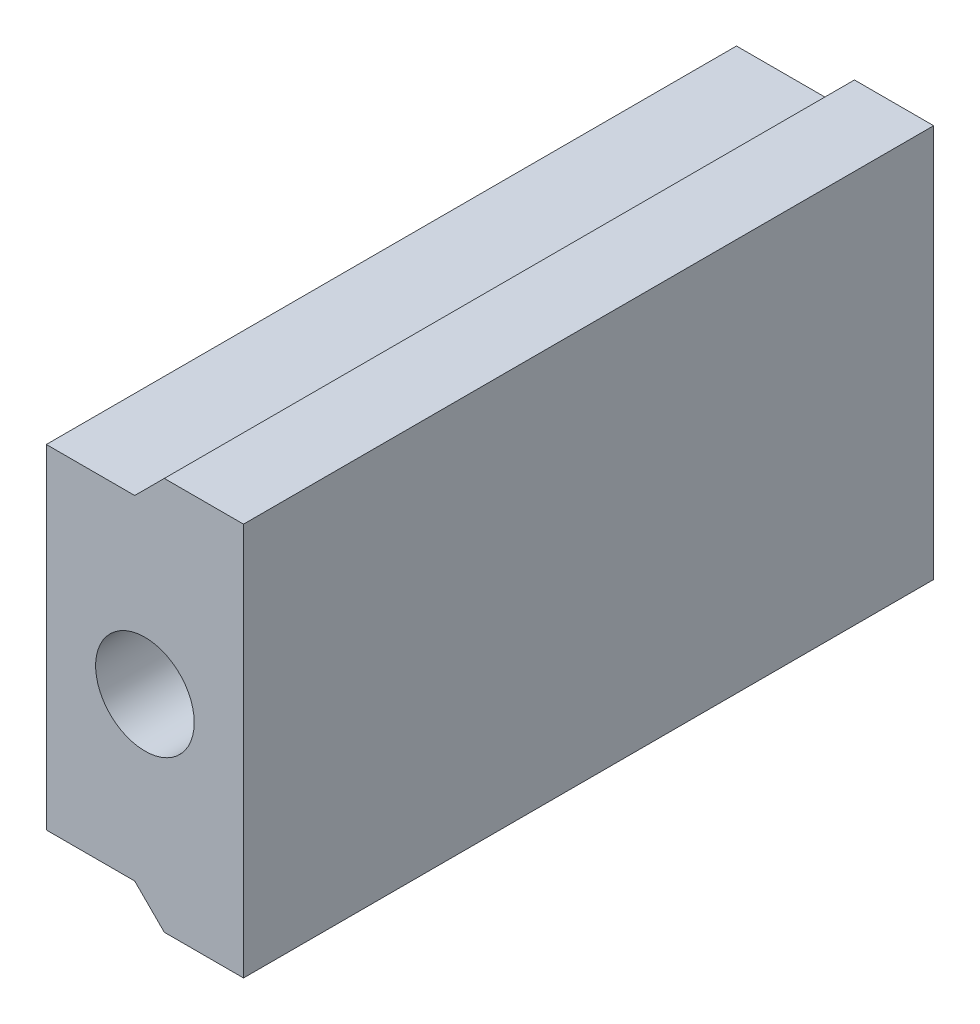
ISO-10303-21;
HEADER;
FILE_DESCRIPTION(('STEP AP214'),'2;1');
FILE_NAME('part.step','',(''),(''),'','','');
FILE_SCHEMA(('AUTOMOTIVE_DESIGN { 1 0 10303 214 1 1 1 1 }'));
ENDSEC;
DATA;
#1=APPLICATION_CONTEXT('core data for automotive mechanical design processes');
#2=APPLICATION_PROTOCOL_DEFINITION('international standard','automotive_design',2000,#1);
#3=PRODUCT_CONTEXT('',#1,'mechanical');
#4=PRODUCT('Part','Part','',(#3));
#5=PRODUCT_RELATED_PRODUCT_CATEGORY('part','',(#4));
#6=PRODUCT_DEFINITION_FORMATION('','',#4);
#7=PRODUCT_DEFINITION_CONTEXT('part definition',#1,'design');
#8=PRODUCT_DEFINITION('design','',#6,#7);
#9=PRODUCT_DEFINITION_SHAPE('','',#8);
#10=(LENGTH_UNIT() NAMED_UNIT(*) SI_UNIT(.MILLI.,.METRE.));
#11=(NAMED_UNIT(*) PLANE_ANGLE_UNIT() SI_UNIT($,.RADIAN.));
#12=(NAMED_UNIT(*) SI_UNIT($,.STERADIAN.) SOLID_ANGLE_UNIT());
#13=UNCERTAINTY_MEASURE_WITH_UNIT(LENGTH_MEASURE(1.E-05),#10,'distance_accuracy_value','');
#14=(GEOMETRIC_REPRESENTATION_CONTEXT(3) GLOBAL_UNCERTAINTY_ASSIGNED_CONTEXT((#13)) GLOBAL_UNIT_ASSIGNED_CONTEXT((#10,
#11,#12)) REPRESENTATION_CONTEXT('',''));
#15=CARTESIAN_POINT('',(0.,0.,0.));
#16=DIRECTION('',(0.,0.,1.));
#17=DIRECTION('',(1.,0.,0.));
#18=AXIS2_PLACEMENT_3D('',#15,#16,#17);
#19=CARTESIAN_POINT('',(-10.,19.932856676292,70.));
#20=DIRECTION('',(1.,0.,0.));
#21=DIRECTION('',(0.,0.,-1.));
#22=AXIS2_PLACEMENT_3D('',#19,#20,#21);
#23=PLANE('',#22);
#24=DIRECTION('',(0.,-1.,0.));
#25=VECTOR('',#24,1.);
#26=CARTESIAN_POINT('',(-10.,19.932856676292,0.));
#27=LINE('',#26,#25);
#28=CARTESIAN_POINT('',(-10.,16.932856676292,0.));
#29=VERTEX_POINT('',#28);
#30=CARTESIAN_POINT('',(-10.,-16.932856676292,0.));
#31=VERTEX_POINT('',#30);
#32=EDGE_CURVE('E132',#29,#31,#27,.T.);
#33=ORIENTED_EDGE('',*,*,#32,.T.);
#34=DIRECTION('',(0.,0.,1.));
#35=VECTOR('',#34,1.);
#36=CARTESIAN_POINT('',(-10.,-16.932856676292,0.));
#37=LINE('',#36,#35);
#38=CARTESIAN_POINT('',(-10.,-16.932856676292,70.));
#39=VERTEX_POINT('',#38);
#40=EDGE_CURVE('E61',#31,#39,#37,.T.);
#41=ORIENTED_EDGE('',*,*,#40,.T.);
#42=DIRECTION('',(0.,-1.,0.));
#43=VECTOR('',#42,1.);
#44=CARTESIAN_POINT('',(-10.,19.932856676292,70.));
#45=LINE('',#44,#43);
#46=CARTESIAN_POINT('',(-10.,16.932856676292,70.));
#47=VERTEX_POINT('',#46);
#48=EDGE_CURVE('E151',#47,#39,#45,.T.);
#49=ORIENTED_EDGE('',*,*,#48,.F.);
#50=DIRECTION('',(0.,0.,1.));
#51=VECTOR('',#50,1.);
#52=CARTESIAN_POINT('',(-10.,16.932856676292,0.));
#53=LINE('',#52,#51);
#54=EDGE_CURVE('E147',#29,#47,#53,.T.);
#55=ORIENTED_EDGE('',*,*,#54,.F.);
#56=EDGE_LOOP('',(#33,#41,#49,#55));
#57=FACE_BOUND('',#56,.T.);
#58=ADVANCED_FACE('F39',(#57),#23,.F.);
#59=CARTESIAN_POINT('',(-10.,19.932856676292,70.));
#60=DIRECTION('',(0.,-1.,0.));
#61=DIRECTION('',(0.,0.,-1.));
#62=AXIS2_PLACEMENT_3D('',#59,#60,#61);
#63=PLANE('',#62);
#64=DIRECTION('',(0.,0.,1.));
#65=VECTOR('',#64,1.);
#66=CARTESIAN_POINT('',(1.96472234354229,19.932856676292,0.));
#67=LINE('',#66,#65);
#68=CARTESIAN_POINT('',(1.96472234354229,19.932856676292,0.));
#69=VERTEX_POINT('',#68);
#70=CARTESIAN_POINT('',(1.96472234354229,19.932856676292,70.));
#71=VERTEX_POINT('',#70);
#72=EDGE_CURVE('E139',#69,#71,#67,.T.);
#73=ORIENTED_EDGE('',*,*,#72,.T.);
#74=DIRECTION('',(-1.,0.,0.));
#75=VECTOR('',#74,1.);
#76=CARTESIAN_POINT('',(-10.,19.932856676292,70.));
#77=LINE('',#76,#75);
#78=CARTESIAN_POINT('',(10.,19.932856676292,70.));
#79=VERTEX_POINT('',#78);
#80=EDGE_CURVE('E159',#79,#71,#77,.T.);
#81=ORIENTED_EDGE('',*,*,#80,.F.);
#82=DIRECTION('',(0.,0.,-1.));
#83=VECTOR('',#82,1.);
#84=CARTESIAN_POINT('',(10.,19.932856676292,70.));
#85=LINE('',#84,#83);
#86=CARTESIAN_POINT('',(10.,19.932856676292,0.));
#87=VERTEX_POINT('',#86);
#88=EDGE_CURVE('E46',#79,#87,#85,.T.);
#89=ORIENTED_EDGE('',*,*,#88,.T.);
#90=DIRECTION('',(-1.,0.,0.));
#91=VECTOR('',#90,1.);
#92=CARTESIAN_POINT('',(-10.,19.932856676292,0.));
#93=LINE('',#92,#91);
#94=EDGE_CURVE('E155',#87,#69,#93,.T.);
#95=ORIENTED_EDGE('',*,*,#94,.T.);
#96=EDGE_LOOP('',(#73,#81,#89,#95));
#97=FACE_BOUND('',#96,.T.);
#98=ADVANCED_FACE('F172',(#97),#63,.F.);
#99=CARTESIAN_POINT('',(0.,0.,70.));
#100=DIRECTION('',(0.,0.,1.));
#101=DIRECTION('',(1.,0.,0.));
#102=AXIS2_PLACEMENT_3D('',#99,#100,#101);
#103=PLANE('',#102);
#104=CARTESIAN_POINT('',(0.,0.,70.));
#105=DIRECTION('',(0.,0.,1.));
#106=DIRECTION('',(1.,0.,0.));
#107=AXIS2_PLACEMENT_3D('',#104,#105,#106);
#108=CIRCLE('',#107,5.);
#109=CARTESIAN_POINT('',(5.,0.,70.));
#110=VERTEX_POINT('',#109);
#111=EDGE_CURVE('E126',#110,#110,#108,.T.);
#112=ORIENTED_EDGE('',*,*,#111,.F.);
#113=EDGE_LOOP('',(#112));
#114=FACE_BOUND('',#113,.T.);
#115=DIRECTION('',(-0.707106781186549,0.707106781186546,0.));
#116=VECTOR('',#115,1.);
#117=CARTESIAN_POINT('',(-8.98406716637488,-8.98406716637492,70.));
#118=LINE('',#117,#116);
#119=CARTESIAN_POINT('',(1.96472234354229,-19.932856676292,70.));
#120=VERTEX_POINT('',#119);
#121=CARTESIAN_POINT('',(-1.03527765645772,-16.932856676292,70.));
#122=VERTEX_POINT('',#121);
#123=EDGE_CURVE('E109',#120,#122,#118,.T.);
#124=ORIENTED_EDGE('',*,*,#123,.F.);
#125=DIRECTION('',(1.,0.,0.));
#126=VECTOR('',#125,1.);
#127=CARTESIAN_POINT('',(-10.,-19.932856676292,70.));
#128=LINE('',#127,#126);
#129=CARTESIAN_POINT('',(10.,-19.932856676292,70.));
#130=VERTEX_POINT('',#129);
#131=EDGE_CURVE('E154',#120,#130,#128,.T.);
#132=ORIENTED_EDGE('',*,*,#131,.T.);
#133=DIRECTION('',(0.,1.,0.));
#134=VECTOR('',#133,1.);
#135=CARTESIAN_POINT('',(10.,19.932856676292,70.));
#136=LINE('',#135,#134);
#137=EDGE_CURVE('E157',#130,#79,#136,.T.);
#138=ORIENTED_EDGE('',*,*,#137,.T.);
#139=ORIENTED_EDGE('',*,*,#80,.T.);
#140=DIRECTION('',(-0.707106781186549,-0.707106781186546,0.));
#141=VECTOR('',#140,1.);
#142=CARTESIAN_POINT('',(-8.98406716637488,8.98406716637492,70.));
#143=LINE('',#142,#141);
#144=CARTESIAN_POINT('',(-1.03527765645772,16.932856676292,70.));
#145=VERTEX_POINT('',#144);
#146=EDGE_CURVE('E140',#71,#145,#143,.T.);
#147=ORIENTED_EDGE('',*,*,#146,.T.);
#148=DIRECTION('',(-1.,0.,0.));
#149=VECTOR('',#148,1.);
#150=CARTESIAN_POINT('',(0.,16.932856676292,70.));
#151=LINE('',#150,#149);
#152=EDGE_CURVE('E137',#145,#47,#151,.T.);
#153=ORIENTED_EDGE('',*,*,#152,.T.);
#154=ORIENTED_EDGE('',*,*,#48,.T.);
#155=DIRECTION('',(-1.,0.,0.));
#156=VECTOR('',#155,1.);
#157=CARTESIAN_POINT('',(0.,-16.932856676292,70.));
#158=LINE('',#157,#156);
#159=EDGE_CURVE('E122',#122,#39,#158,.T.);
#160=ORIENTED_EDGE('',*,*,#159,.F.);
#161=EDGE_LOOP('',(#124,#132,#138,#139,#147,#153,#154,#160));
#162=FACE_BOUND('',#161,.T.);
#163=ADVANCED_FACE('F180',(#114,#162),#103,.T.);
#164=CARTESIAN_POINT('',(0.,0.,0.));
#165=DIRECTION('',(0.,0.,1.));
#166=DIRECTION('',(1.,0.,0.));
#167=AXIS2_PLACEMENT_3D('',#164,#165,#166);
#168=PLANE('',#167);
#169=CARTESIAN_POINT('',(0.,0.,0.));
#170=DIRECTION('',(0.,0.,1.));
#171=DIRECTION('',(1.,0.,0.));
#172=AXIS2_PLACEMENT_3D('',#169,#170,#171);
#173=CIRCLE('',#172,5.);
#174=CARTESIAN_POINT('',(5.,0.,0.));
#175=VERTEX_POINT('',#174);
#176=EDGE_CURVE('E143',#175,#175,#173,.T.);
#177=ORIENTED_EDGE('',*,*,#176,.T.);
#178=EDGE_LOOP('',(#177));
#179=FACE_BOUND('',#178,.T.);
#180=DIRECTION('',(1.,0.,0.));
#181=VECTOR('',#180,1.);
#182=CARTESIAN_POINT('',(-10.,-19.932856676292,0.));
#183=LINE('',#182,#181);
#184=CARTESIAN_POINT('',(1.96472234354229,-19.932856676292,0.));
#185=VERTEX_POINT('',#184);
#186=CARTESIAN_POINT('',(10.,-19.932856676292,0.));
#187=VERTEX_POINT('',#186);
#188=EDGE_CURVE('E121',#185,#187,#183,.T.);
#189=ORIENTED_EDGE('',*,*,#188,.F.);
#190=DIRECTION('',(-0.707106781186549,0.707106781186546,0.));
#191=VECTOR('',#190,1.);
#192=CARTESIAN_POINT('',(-8.98406716637488,-8.98406716637492,0.));
#193=LINE('',#192,#191);
#194=CARTESIAN_POINT('',(-1.03527765645772,-16.932856676292,0.));
#195=VERTEX_POINT('',#194);
#196=EDGE_CURVE('E106',#185,#195,#193,.T.);
#197=ORIENTED_EDGE('',*,*,#196,.T.);
#198=DIRECTION('',(-1.,0.,0.));
#199=VECTOR('',#198,1.);
#200=CARTESIAN_POINT('',(0.,-16.932856676292,0.));
#201=LINE('',#200,#199);
#202=EDGE_CURVE('E111',#195,#31,#201,.T.);
#203=ORIENTED_EDGE('',*,*,#202,.T.);
#204=ORIENTED_EDGE('',*,*,#32,.F.);
#205=DIRECTION('',(-1.,0.,0.));
#206=VECTOR('',#205,1.);
#207=CARTESIAN_POINT('',(0.,16.932856676292,0.));
#208=LINE('',#207,#206);
#209=CARTESIAN_POINT('',(-1.03527765645772,16.932856676292,0.));
#210=VERTEX_POINT('',#209);
#211=EDGE_CURVE('E136',#210,#29,#208,.T.);
#212=ORIENTED_EDGE('',*,*,#211,.F.);
#213=DIRECTION('',(-0.707106781186549,-0.707106781186546,0.));
#214=VECTOR('',#213,1.);
#215=CARTESIAN_POINT('',(-8.98406716637488,8.98406716637492,0.));
#216=LINE('',#215,#214);
#217=EDGE_CURVE('E134',#69,#210,#216,.T.);
#218=ORIENTED_EDGE('',*,*,#217,.F.);
#219=ORIENTED_EDGE('',*,*,#94,.F.);
#220=DIRECTION('',(0.,1.,0.));
#221=VECTOR('',#220,1.);
#222=CARTESIAN_POINT('',(10.,19.932856676292,0.));
#223=LINE('',#222,#221);
#224=EDGE_CURVE('E164',#187,#87,#223,.T.);
#225=ORIENTED_EDGE('',*,*,#224,.F.);
#226=EDGE_LOOP('',(#189,#197,#203,#204,#212,#218,#219,#225));
#227=FACE_BOUND('',#226,.T.);
#228=ADVANCED_FACE('F119',(#179,#227),#168,.F.);
#229=CARTESIAN_POINT('',(-10.,-19.932856676292,70.));
#230=DIRECTION('',(0.,1.,0.));
#231=DIRECTION('',(0.,0.,1.));
#232=AXIS2_PLACEMENT_3D('',#229,#230,#231);
#233=PLANE('',#232);
#234=ORIENTED_EDGE('',*,*,#131,.F.);
#235=DIRECTION('',(0.,0.,1.));
#236=VECTOR('',#235,1.);
#237=CARTESIAN_POINT('',(1.96472234354229,-19.932856676292,0.));
#238=LINE('',#237,#236);
#239=EDGE_CURVE('E130',#185,#120,#238,.T.);
#240=ORIENTED_EDGE('',*,*,#239,.F.);
#241=ORIENTED_EDGE('',*,*,#188,.T.);
#242=DIRECTION('',(0.,0.,-1.));
#243=VECTOR('',#242,1.);
#244=CARTESIAN_POINT('',(10.,-19.932856676292,70.));
#245=LINE('',#244,#243);
#246=EDGE_CURVE('E11',#130,#187,#245,.T.);
#247=ORIENTED_EDGE('',*,*,#246,.F.);
#248=EDGE_LOOP('',(#234,#240,#241,#247));
#249=FACE_BOUND('',#248,.T.);
#250=ADVANCED_FACE('F185',(#249),#233,.F.);
#251=CARTESIAN_POINT('',(10.,19.932856676292,70.));
#252=DIRECTION('',(-1.,0.,0.));
#253=DIRECTION('',(0.,0.,1.));
#254=AXIS2_PLACEMENT_3D('',#251,#252,#253);
#255=PLANE('',#254);
#256=ORIENTED_EDGE('',*,*,#224,.T.);
#257=ORIENTED_EDGE('',*,*,#88,.F.);
#258=ORIENTED_EDGE('',*,*,#137,.F.);
#259=ORIENTED_EDGE('',*,*,#246,.T.);
#260=EDGE_LOOP('',(#256,#257,#258,#259));
#261=FACE_BOUND('',#260,.T.);
#262=ADVANCED_FACE('F183',(#261),#255,.F.);
#263=CARTESIAN_POINT('',(-8.98406716637488,8.98406716637492,0.));
#264=DIRECTION('',(-0.707106781186546,0.707106781186549,0.));
#265=DIRECTION('',(-0.707106781186549,-0.707106781186546,0.));
#266=AXIS2_PLACEMENT_3D('',#263,#264,#265);
#267=PLANE('',#266);
#268=ORIENTED_EDGE('',*,*,#146,.F.);
#269=ORIENTED_EDGE('',*,*,#72,.F.);
#270=ORIENTED_EDGE('',*,*,#217,.T.);
#271=DIRECTION('',(0.,0.,1.));
#272=VECTOR('',#271,1.);
#273=CARTESIAN_POINT('',(-1.03527765645772,16.932856676292,0.));
#274=LINE('',#273,#272);
#275=EDGE_CURVE('E53',#210,#145,#274,.T.);
#276=ORIENTED_EDGE('',*,*,#275,.T.);
#277=EDGE_LOOP('',(#268,#269,#270,#276));
#278=FACE_BOUND('',#277,.T.);
#279=ADVANCED_FACE('F178',(#278),#267,.T.);
#280=CARTESIAN_POINT('',(0.,16.932856676292,0.));
#281=DIRECTION('',(0.,1.,0.));
#282=DIRECTION('',(0.,0.,1.));
#283=AXIS2_PLACEMENT_3D('',#280,#281,#282);
#284=PLANE('',#283);
#285=ORIENTED_EDGE('',*,*,#152,.F.);
#286=ORIENTED_EDGE('',*,*,#275,.F.);
#287=ORIENTED_EDGE('',*,*,#211,.T.);
#288=ORIENTED_EDGE('',*,*,#54,.T.);
#289=EDGE_LOOP('',(#285,#286,#287,#288));
#290=FACE_BOUND('',#289,.T.);
#291=ADVANCED_FACE('F189',(#290),#284,.T.);
#292=CARTESIAN_POINT('',(-8.98406716637488,-8.98406716637492,0.));
#293=DIRECTION('',(0.707106781186546,0.707106781186549,0.));
#294=DIRECTION('',(-0.707106781186549,0.707106781186546,0.));
#295=AXIS2_PLACEMENT_3D('',#292,#293,#294);
#296=PLANE('',#295);
#297=ORIENTED_EDGE('',*,*,#123,.T.);
#298=DIRECTION('',(0.,0.,1.));
#299=VECTOR('',#298,1.);
#300=CARTESIAN_POINT('',(-1.03527765645772,-16.932856676292,0.));
#301=LINE('',#300,#299);
#302=EDGE_CURVE('E103',#195,#122,#301,.T.);
#303=ORIENTED_EDGE('',*,*,#302,.F.);
#304=ORIENTED_EDGE('',*,*,#196,.F.);
#305=ORIENTED_EDGE('',*,*,#239,.T.);
#306=EDGE_LOOP('',(#297,#303,#304,#305));
#307=FACE_BOUND('',#306,.T.);
#308=ADVANCED_FACE('F104',(#307),#296,.F.);
#309=CARTESIAN_POINT('',(0.,-16.932856676292,0.));
#310=DIRECTION('',(0.,1.,0.));
#311=DIRECTION('',(0.,0.,1.));
#312=AXIS2_PLACEMENT_3D('',#309,#310,#311);
#313=PLANE('',#312);
#314=ORIENTED_EDGE('',*,*,#159,.T.);
#315=ORIENTED_EDGE('',*,*,#40,.F.);
#316=ORIENTED_EDGE('',*,*,#202,.F.);
#317=ORIENTED_EDGE('',*,*,#302,.T.);
#318=EDGE_LOOP('',(#314,#315,#316,#317));
#319=FACE_BOUND('',#318,.T.);
#320=ADVANCED_FACE('F113',(#319),#313,.F.);
#321=CARTESIAN_POINT('',(0.,0.,0.));
#322=DIRECTION('',(0.,0.,1.));
#323=DIRECTION('',(1.,0.,0.));
#324=AXIS2_PLACEMENT_3D('',#321,#322,#323);
#325=CYLINDRICAL_SURFACE('',#324,5.);
#326=ORIENTED_EDGE('',*,*,#176,.F.);
#327=EDGE_LOOP('',(#326));
#328=FACE_BOUND('',#327,.T.);
#329=ORIENTED_EDGE('',*,*,#111,.T.);
#330=EDGE_LOOP('',(#329));
#331=FACE_BOUND('',#330,.T.);
#332=ADVANCED_FACE('F224',(#328,#331),#325,.F.);
#333=CLOSED_SHELL('',(#58,#98,#163,#228,#250,#262,#279,#291,#308,#320,#332));
#334=MANIFOLD_SOLID_BREP('B2',#333);
#335=ADVANCED_BREP_SHAPE_REPRESENTATION('',(#18,#334),#14);
#336=SHAPE_DEFINITION_REPRESENTATION(#9,#335);
ENDSEC;
END-ISO-10303-21;
